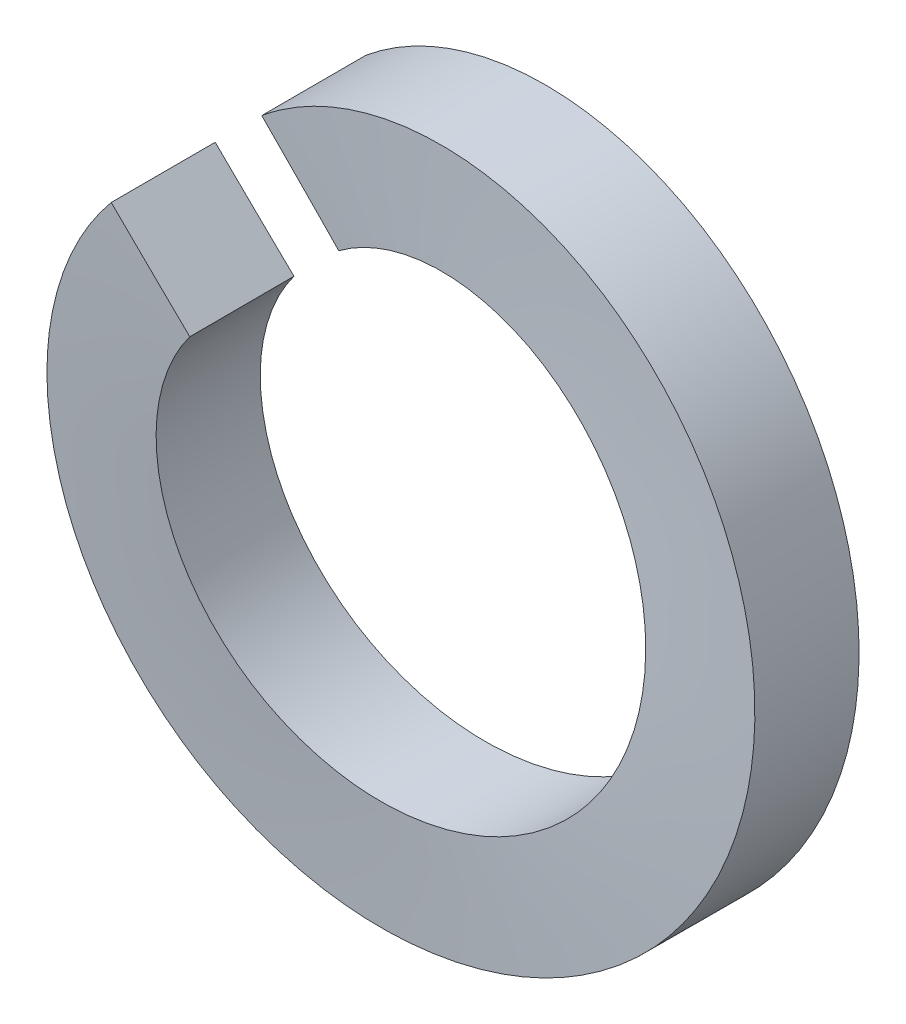
ISO-10303-21;
HEADER;
FILE_DESCRIPTION(('STEP AP214'),'2;1');
FILE_NAME('part.step','',(''),(''),'','','');
FILE_SCHEMA(('AUTOMOTIVE_DESIGN { 1 0 10303 214 1 1 1 1 }'));
ENDSEC;
DATA;
#1=APPLICATION_CONTEXT('core data for automotive mechanical design processes');
#2=APPLICATION_PROTOCOL_DEFINITION('international standard','automotive_design',2000,#1);
#3=PRODUCT_CONTEXT('',#1,'mechanical');
#4=PRODUCT('Part','Part','',(#3));
#5=PRODUCT_RELATED_PRODUCT_CATEGORY('part','',(#4));
#6=PRODUCT_DEFINITION_FORMATION('','',#4);
#7=PRODUCT_DEFINITION_CONTEXT('part definition',#1,'design');
#8=PRODUCT_DEFINITION('design','',#6,#7);
#9=PRODUCT_DEFINITION_SHAPE('','',#8);
#10=(LENGTH_UNIT() NAMED_UNIT(*) SI_UNIT(.MILLI.,.METRE.));
#11=(NAMED_UNIT(*) PLANE_ANGLE_UNIT() SI_UNIT($,.RADIAN.));
#12=(NAMED_UNIT(*) SI_UNIT($,.STERADIAN.) SOLID_ANGLE_UNIT());
#13=UNCERTAINTY_MEASURE_WITH_UNIT(LENGTH_MEASURE(1.E-05),#10,'distance_accuracy_value','');
#14=(GEOMETRIC_REPRESENTATION_CONTEXT(3) GLOBAL_UNCERTAINTY_ASSIGNED_CONTEXT((#13)) GLOBAL_UNIT_ASSIGNED_CONTEXT((#10,
#11,#12)) REPRESENTATION_CONTEXT('',''));
#15=CARTESIAN_POINT('',(0.,0.,0.));
#16=DIRECTION('',(0.,0.,1.));
#17=DIRECTION('',(1.,0.,0.));
#18=AXIS2_PLACEMENT_3D('',#15,#16,#17);
#19=CARTESIAN_POINT('',(-0.79717352333944,-0.298841987499716,-2.94193677893216));
#20=DIRECTION('',(-0.707106781186547,-0.707106781186548,0.));
#21=DIRECTION('',(-0.707106781186548,0.707106781186547,0.));
#22=AXIS2_PLACEMENT_3D('',#19,#20,#21);
#23=PLANE('',#22);
#24=CARTESIAN_POINT('',(-4.83003302335356,3.73401751251441,0.233956789733909));
#25=CARTESIAN_POINT('',(-4.82942869376248,3.73341318292332,0.480258416201876));
#26=CARTESIAN_POINT('',(-4.82889978139412,3.73288427055496,0.72656043590296));
#27=CARTESIAN_POINT('',(-4.82844636876401,3.73243085792486,0.972862710482893));
#28=CARTESIAN_POINT('',(-4.82776624871645,3.7317507378773,1.34231672119706));
#29=CARTESIAN_POINT('',(-4.82725600894082,3.73124049810167,1.71177143564769));
#30=CARTESIAN_POINT('',(-4.82691582892287,3.73090031808371,2.08122638515365));
#31=CARTESIAN_POINT('',(-4.8265756483286,3.73056013748944,2.45068196055829));
#32=CARTESIAN_POINT('',(-4.82640552795078,3.73039001711163,2.82013792746677));
#33=CARTESIAN_POINT('',(-4.82640552795078,3.73039001711163,3.18959381609657));
#34=(BOUNDED_CURVE() B_SPLINE_CURVE(3,(#24,#25,#26,#27,#28,#29,#30,#31,#32,#33),.UNSPECIFIED.,
.F.,.F.) B_SPLINE_CURVE_WITH_KNOTS((4,3,3,4),(0.,0.000738909327768621,0.00184727524639722,
0.0029556430429443),
.UNSPECIFIED.) CURVE() GEOMETRIC_REPRESENTATION_ITEM() RATIONAL_B_SPLINE_CURVE((1.,1.,1.,1.,1.,
1.,1.,1.,1.,1.)) REPRESENTATION_ITEM(''));
#35=CARTESIAN_POINT('',(-4.83003302335356,3.73401751251441,0.233956789733909));
#36=VERTEX_POINT('',#35);
#37=CARTESIAN_POINT('',(-4.82640552795078,3.73039001711163,3.18959381609657));
#38=VERTEX_POINT('',#37);
#39=EDGE_CURVE('E90',#36,#38,#34,.T.);
#40=ORIENTED_EDGE('',*,*,#39,.F.);
#41=CARTESIAN_POINT('',(-7.03266197867871,5.93664646783831,0.263458357318975));
#42=CARTESIAN_POINT('',(-6.93459888887038,5.83858145641255,0.262589733309795));
#43=CARTESIAN_POINT('',(-6.8365383405626,5.74051423528715,0.261682285772375));
#44=CARTESIAN_POINT('',(-6.64460715068996,5.54857100489026,0.259817397518075));
#45=CARTESIAN_POINT('',(-6.55073651244149,5.45469495535241,0.258863749689647));
#46=CARTESIAN_POINT('',(-6.36718086196401,5.27113870108968,0.256906559268797));
#47=CARTESIAN_POINT('',(-6.27749605053265,5.18145825180581,0.255907143965681));
#48=CARTESIAN_POINT('',(-6.10231425396689,5.00629057531517,0.253857861133127));
#49=CARTESIAN_POINT('',(-6.01681737315664,4.92080319082117,0.252812532189602));
#50=CARTESIAN_POINT('',(-5.83187683803377,4.73585978614604,0.250437601692356));
#51=CARTESIAN_POINT('',(-5.73243521311544,4.63640197273893,0.24908945246533));
#52=CARTESIAN_POINT('',(-5.53866662832727,4.44260513698395,0.246300117609943));
#53=CARTESIAN_POINT('',(-5.44433969326801,4.34826597004379,0.244867284773658));
#54=CARTESIAN_POINT('',(-5.26079041912217,4.16471749134578,0.241908164560969));
#55=CARTESIAN_POINT('',(-5.1715686728636,4.07550743853658,0.240391159500856));
#56=CARTESIAN_POINT('',(-4.99824081618342,3.90220506264143,0.237260448250175));
#57=CARTESIAN_POINT('',(-4.91413468957235,3.81811256487991,0.235657272741076));
#58=CARTESIAN_POINT('',(-4.83003302335348,3.73401751251451,0.233956789733921));
#59=B_SPLINE_CURVE_WITH_KNOTS('',3,(#41,#42,#43,#44,#45,#46,#47,#48,#49,#50,#51,#52,#53,#54,#55,
#56,#57,#58),.UNSPECIFIED.,.F.,.F.,(4,2,2,2,2,2,2,2,4),(0.,0.416058698813507,0.814339815610209,
1.19484277004973,1.55756869060549,1.97951741246603,2.37976164285733,2.75829987487904,
3.11513536136346),.UNSPECIFIED.);
#60=CARTESIAN_POINT('',(-7.03266197867871,5.93664646783831,0.263458357318974));
#61=VERTEX_POINT('',#60);
#62=EDGE_CURVE('E76',#61,#36,#59,.T.);
#63=ORIENTED_EDGE('',*,*,#62,.F.);
#64=CARTESIAN_POINT('',(-7.03026719947147,5.93425168863231,3.21187950314586));
#65=CARTESIAN_POINT('',(-7.03026719947147,5.93425168863231,2.96617773085928));
#66=CARTESIAN_POINT('',(-7.03031710092935,5.93430159009019,2.72047594843941));
#67=CARTESIAN_POINT('',(-7.03041689996159,5.93440138912244,2.47477421668915));
#68=CARTESIAN_POINT('',(-7.03056659861644,5.93455108777728,2.10622135690906));
#69=CARTESIAN_POINT('',(-7.03082856860665,5.93481305776749,1.7376685541582));
#70=CARTESIAN_POINT('',(-7.03120276791604,5.93518725707688,1.36911601350597));
#71=CARTESIAN_POINT('',(-7.03157696750304,5.93556145666388,1.00056319943737));
#72=CARTESIAN_POINT('',(-7.03206339663907,5.93604788579991,0.632010579137902));
#73=CARTESIAN_POINT('',(-7.03266197867871,5.93664646783831,0.263458357318974));
#74=(BOUNDED_CURVE() B_SPLINE_CURVE(3,(#64,#65,#66,#67,#68,#69,#70,#71,#72,#73),.UNSPECIFIED.,
.F.,.F.) B_SPLINE_CURVE_WITH_KNOTS((4,3,3,4),(0.,0.000737105316859754,0.0018427641355887,
0.00294842377449577),
.UNSPECIFIED.) CURVE() GEOMETRIC_REPRESENTATION_ITEM() RATIONAL_B_SPLINE_CURVE((1.,1.,1.,1.,1.,
1.,1.,1.,1.,1.)) REPRESENTATION_ITEM(''));
#75=CARTESIAN_POINT('',(-7.03026719947147,5.93425168863231,3.21187950314586));
#76=VERTEX_POINT('',#75);
#77=EDGE_CURVE('E31',#76,#61,#74,.T.);
#78=ORIENTED_EDGE('',*,*,#77,.F.);
#79=CARTESIAN_POINT('',(-4.82640552795078,3.73039001711163,3.18959381609657));
#80=CARTESIAN_POINT('',(-5.01550774301604,3.91949223217689,3.19248624401942));
#81=CARTESIAN_POINT('',(-5.20461291247181,4.10859740163265,3.19500315576721));
#82=CARTESIAN_POINT('',(-5.39371944648951,4.29770393565035,3.19726129838612));
#83=CARTESIAN_POINT('',(-5.58282590428486,4.4868103934457,3.19951944009485));
#84=CARTESIAN_POINT('',(-5.77193396066378,4.67591844982462,3.20151717024981));
#85=CARTESIAN_POINT('',(-5.96104282447109,4.86502731363194,3.20332803269508));
#86=CARTESIAN_POINT('',(-6.317448478768,5.22143296792885,3.20674089025053));
#87=CARTESIAN_POINT('',(-6.67385734981149,5.57784183897233,3.20949905003783));
#88=CARTESIAN_POINT('',(-7.03026719947147,5.93425168863231,3.21187950314586));
#89=(BOUNDED_CURVE() B_SPLINE_CURVE(3,(#79,#80,#81,#82,#83,#84,#85,#86,#87,#88),.UNSPECIFIED.,
.F.,.F.) B_SPLINE_CURVE_WITH_KNOTS((4,3,3,4),(0.,0.000802339675337197,0.00160467884234959,
0.00311681475547326),
.UNSPECIFIED.) CURVE() GEOMETRIC_REPRESENTATION_ITEM() RATIONAL_B_SPLINE_CURVE((1.,1.,1.,1.,1.,
1.,1.,1.,1.,1.)) REPRESENTATION_ITEM(''));
#90=EDGE_CURVE('E92',#38,#76,#89,.T.);
#91=ORIENTED_EDGE('',*,*,#90,.F.);
#92=EDGE_LOOP('',(#40,#63,#78,#91));
#93=FACE_BOUND('',#92,.T.);
#94=ADVANCED_FACE('F16',(#93),#23,.F.);
#95=CARTESIAN_POINT('',(-34.7029436812344,35.7989591920735,-2.94193677893216));
#96=DIRECTION('',(0.707106781186547,0.707106781186548,0.));
#97=DIRECTION('',(0.,0.,-1.));
#98=AXIS2_PLACEMENT_3D('',#95,#96,#97);
#99=PLANE('',#98);
#100=CARTESIAN_POINT('',(-5.93664646783898,7.03266197867814,-2.90526477562874));
#101=CARTESIAN_POINT('',(-5.93624740887282,7.03226291971198,-2.65956664083558));
#102=CARTESIAN_POINT('',(-5.9358981972157,7.03191370805485,-2.41386833399742));
#103=CARTESIAN_POINT('',(-5.93559885637714,7.03161436721629,-2.16816991575449));
#104=CARTESIAN_POINT('',(-5.93514984480018,7.03116535563934,-1.79962202646663));
#105=CARTESIAN_POINT('',(-5.93481304426725,7.0308285551064,-1.43107382956403));
#106=CARTESIAN_POINT('',(-5.93458850527651,7.03060401611566,-1.06252553003491));
#107=CARTESIAN_POINT('',(-5.93436396611914,7.0303794769583,-0.693976957004398));
#108=CARTESIAN_POINT('',(-5.93425168863232,7.03026719947147,-0.325428212977408));
#109=CARTESIAN_POINT('',(-5.93425168863221,7.03026719947156,0.0431204968541365));
#110=(BOUNDED_CURVE() B_SPLINE_CURVE(3,(#100,#101,#102,#103,#104,#105,#106,#107,#108,#109),
.UNSPECIFIED.,.F.,.F.) B_SPLINE_CURVE_WITH_KNOTS((4,3,3,4),(0.,0.000737096348812416,
0.00184274171479007,0.00294838790131264),
.UNSPECIFIED.) CURVE() GEOMETRIC_REPRESENTATION_ITEM() RATIONAL_B_SPLINE_CURVE((1.,1.,1.,1.,1.,
1.,1.,1.,1.,1.)) REPRESENTATION_ITEM(''));
#111=CARTESIAN_POINT('',(-5.93664646783898,7.03266197867814,-2.90526477562874));
#112=VERTEX_POINT('',#111);
#113=CARTESIAN_POINT('',(-5.93425168863221,7.03026719947156,0.0431204968541365));
#114=VERTEX_POINT('',#113);
#115=EDGE_CURVE('E10',#112,#114,#110,.T.);
#116=ORIENTED_EDGE('',*,*,#115,.F.);
#117=CARTESIAN_POINT('',(-3.73401751251441,4.83003302335356,-2.89022457300165));
#118=CARTESIAN_POINT('',(-3.92312566222214,5.01914117306129,-2.89217791580275));
#119=CARTESIAN_POINT('',(-4.11223516142621,5.20825067226537,-2.8938772478152));
#120=CARTESIAN_POINT('',(-4.30134528266825,5.39736079350741,-2.8954017829888));
#121=CARTESIAN_POINT('',(-4.4904553689851,5.58647087982426,-2.89692631788084));
#122=CARTESIAN_POINT('',(-4.67956618436761,5.77558169520676,-2.89827492761064));
#123=CARTESIAN_POINT('',(-4.8686773676421,5.96469287848125,-2.89949739282771));
#124=CARTESIAN_POINT('',(-5.22466594429587,6.32068145513502,-2.90179859810332));
#125=CARTESIAN_POINT('',(-5.58065598338201,6.67667149422116,-2.90365887592926));
#126=CARTESIAN_POINT('',(-5.93664646783898,7.03266197867814,-2.90526477562874));
#127=(BOUNDED_CURVE() B_SPLINE_CURVE(3,(#117,#118,#119,#120,#121,#122,#123,#124,#125,#126),
.UNSPECIFIED.,.F.,.F.) B_SPLINE_CURVE_WITH_KNOTS((4,3,3,4),(0.,0.00080233933038256,
0.00160467842791897,0.00311502587816711),
.UNSPECIFIED.) CURVE() GEOMETRIC_REPRESENTATION_ITEM() RATIONAL_B_SPLINE_CURVE((1.,1.,1.,1.,1.,
1.,1.,1.,1.,1.)) REPRESENTATION_ITEM(''));
#128=CARTESIAN_POINT('',(-3.73401751251441,4.83003302335356,-2.89022457300165));
#129=VERTEX_POINT('',#128);
#130=EDGE_CURVE('E86',#129,#112,#127,.T.);
#131=ORIENTED_EDGE('',*,*,#130,.F.);
#132=CARTESIAN_POINT('',(-3.73039001711163,4.82640552795078,0.0654061839034188));
#133=CARTESIAN_POINT('',(-3.73039001711163,4.82640552795078,-0.427199127865151));
#134=CARTESIAN_POINT('',(-3.73069246402826,4.82670797486741,-0.91980462509811));
#135=CARTESIAN_POINT('',(-3.73129716999029,4.82731268082945,-1.41240919454911));
#136=CARTESIAN_POINT('',(-3.73159952379665,4.8276150346358,-1.65871215160789));
#137=CARTESIAN_POINT('',(-3.73197743693886,4.82799294777801,-1.90501494630183));
#138=CARTESIAN_POINT('',(-3.73243085060459,4.82844636144374,-2.15131743984105));
#139=CARTESIAN_POINT('',(-3.73288426461122,4.82889977545037,-2.3976201185631));
#140=CARTESIAN_POINT('',(-3.73341317933273,4.82942869017189,-2.64392254240305));
#141=CARTESIAN_POINT('',(-3.73401751251441,4.83003302335356,-2.89022457300165));
#142=(BOUNDED_CURVE() B_SPLINE_CURVE(3,(#132,#133,#134,#135,#136,#137,#138,#139,#140,#141),
.UNSPECIFIED.,.F.,.F.) B_SPLINE_CURVE_WITH_KNOTS((4,3,3,4),(0.,0.00147781593530571,
0.00221672571115192,0.00295563604246229),
.UNSPECIFIED.) CURVE() GEOMETRIC_REPRESENTATION_ITEM() RATIONAL_B_SPLINE_CURVE((1.,1.,1.,1.,1.,
1.,1.,1.,1.,1.)) REPRESENTATION_ITEM(''));
#143=CARTESIAN_POINT('',(-3.73039001711163,4.82640552795078,0.0654061839034188));
#144=VERTEX_POINT('',#143);
#145=EDGE_CURVE('E97',#144,#129,#142,.T.);
#146=ORIENTED_EDGE('',*,*,#145,.F.);
#147=CARTESIAN_POINT('',(-5.93425168863221,7.03026719947156,0.0431204968541365));
#148=CARTESIAN_POINT('',(-5.74514065292749,6.84115616376664,0.0443835650693762));
#149=CARTESIAN_POINT('',(-5.55602995618481,6.65204546702397,0.0457562183701629));
#150=CARTESIAN_POINT('',(-5.36691985353237,6.46293536437153,0.0472731697832934));
#151=CARTESIAN_POINT('',(-5.17780973613226,6.27382524697141,0.0487901213147227));
#152=CARTESIAN_POINT('',(-4.98870014651119,6.08471565735034,0.0504508636932461));
#153=CARTESIAN_POINT('',(-4.79959153775048,5.89560704858964,0.0523062163031964));
#154=CARTESIAN_POINT('',(-4.44318623242566,5.53920174326481,0.0558029239241135));
#155=CARTESIAN_POINT('',(-4.08678305456905,5.18279856540821,0.0599549459436002));
#156=CARTESIAN_POINT('',(-3.73039001711163,4.82640552795078,0.0654061839034188));
#157=(BOUNDED_CURVE() B_SPLINE_CURVE(3,(#147,#148,#149,#150,#151,#152,#153,#154,#155,#156),
.UNSPECIFIED.,.F.,.F.) B_SPLINE_CURVE_WITH_KNOTS((4,3,3,4),(0.,0.000802339122147359,
0.00160467835295775,0.00311681639490489),
.UNSPECIFIED.) CURVE() GEOMETRIC_REPRESENTATION_ITEM() RATIONAL_B_SPLINE_CURVE((1.,1.,1.,1.,1.,
1.,1.,1.,1.,1.)) REPRESENTATION_ITEM(''));
#158=EDGE_CURVE('E102',#114,#144,#157,.T.);
#159=ORIENTED_EDGE('',*,*,#158,.F.);
#160=EDGE_LOOP('',(#116,#131,#146,#159));
#161=FACE_BOUND('',#160,.T.);
#162=ADVANCED_FACE('F146',(#161),#99,.F.);
#163=CARTESIAN_POINT('',(-6.32916406997627,6.6816007038562,0.320563221067842));
#164=CARTESIAN_POINT('',(-8.11949358272176,4.98570630254198,0.184938221067843));
#165=CARTESIAN_POINT('',(-8.82201722124726,2.62185391249532,0.0493132210678426));
#166=CARTESIAN_POINT('',(-9.52454085977277,0.258001522448659,-0.0863117789321575));
#167=CARTESIAN_POINT('',(-8.95101798247159,-2.14041651739106,-0.221936778932158));
#168=CARTESIAN_POINT('',(-8.37749510517042,-4.53883455723078,-0.357561778932157));
#169=CARTESIAN_POINT('',(-6.6816007038562,-6.32916406997627,-0.493186778932158));
#170=CARTESIAN_POINT('',(-4.98570630254198,-8.11949358272176,-0.628811778932158));
#171=CARTESIAN_POINT('',(-2.62185391249532,-8.82201722124726,-0.764436778932157));
#172=CARTESIAN_POINT('',(-0.25800152244866,-9.52454085977277,-0.900061778932158));
#173=CARTESIAN_POINT('',(2.14041651739105,-8.95101798247159,-1.03568677893216));
#174=CARTESIAN_POINT('',(4.53883455723078,-8.37749510517042,-1.17131177893216));
#175=CARTESIAN_POINT('',(6.32916406997627,-6.6816007038562,-1.30693677893216));
#176=CARTESIAN_POINT('',(8.11949358272176,-4.98570630254198,-1.44256177893216));
#177=CARTESIAN_POINT('',(8.82201722124726,-2.62185391249532,-1.57818677893216));
#178=CARTESIAN_POINT('',(9.52454085977277,-0.258001522448663,-1.71381177893216));
#179=CARTESIAN_POINT('',(8.95101798247159,2.14041651739105,-1.84943677893216));
#180=CARTESIAN_POINT('',(8.37749510517042,4.53883455723077,-1.98506177893216));
#181=CARTESIAN_POINT('',(6.6816007038562,6.32916406997627,-2.12068677893216));
#182=CARTESIAN_POINT('',(4.98570630254198,8.11949358272176,-2.25631177893216));
#183=CARTESIAN_POINT('',(2.62185391249533,8.82201722124726,-2.39193677893216));
#184=CARTESIAN_POINT('',(0.258001522448662,9.52454085977277,-2.52756177893216));
#185=CARTESIAN_POINT('',(-2.14041651739105,8.95101798247159,-2.66318677893216));
#186=CARTESIAN_POINT('',(-4.53883455723077,8.37749510517042,-2.79881177893216));
#187=CARTESIAN_POINT('',(-6.32916406997627,6.6816007038562,-2.93443677893216));
#188=CARTESIAN_POINT('',(-6.50538238691618,6.50538238691629,3.255));
#189=CARTESIAN_POINT('',(-8.24849434394605,4.76227042988646,3.119375));
#190=CARTESIAN_POINT('',(-8.8865176018594,2.38113521494327,2.98375));
#191=CARTESIAN_POINT('',(-9.52454085977277,0.,2.848125));
#192=CARTESIAN_POINT('',(-8.88651760185945,-2.38113521494311,2.7125));
#193=CARTESIAN_POINT('',(-8.24849434394613,-4.7622704298863,2.576875));
#194=CARTESIAN_POINT('',(-6.50538238691629,-6.50538238691618,2.44125));
#195=CARTESIAN_POINT('',(-4.76227042988646,-8.24849434394605,2.305625));
#196=CARTESIAN_POINT('',(-2.38113521494327,-8.8865176018594,2.17));
#197=CARTESIAN_POINT('',(0.,-9.52454085977277,2.034375));
#198=CARTESIAN_POINT('',(2.38113521494311,-8.88651760185945,1.89875));
#199=CARTESIAN_POINT('',(4.7622704298863,-8.24849434394613,1.763125));
#200=CARTESIAN_POINT('',(6.50538238691617,-6.50538238691629,1.6275));
#201=CARTESIAN_POINT('',(8.24849434394605,-4.76227042988646,1.491875));
#202=CARTESIAN_POINT('',(8.8865176018594,-2.38113521494327,1.35625));
#203=CARTESIAN_POINT('',(9.52454085977277,0.,1.220625));
#204=CARTESIAN_POINT('',(8.88651760185945,2.38113521494311,1.085));
#205=CARTESIAN_POINT('',(8.24849434394613,4.7622704298863,0.949375));
#206=CARTESIAN_POINT('',(6.50538238691629,6.50538238691617,0.81375));
#207=CARTESIAN_POINT('',(4.76227042988647,8.24849434394605,0.678125));
#208=CARTESIAN_POINT('',(2.38113521494327,8.8865176018594,0.5425));
#209=CARTESIAN_POINT('',(0.,9.52454085977277,0.406874999999999));
#210=CARTESIAN_POINT('',(-2.38113521494311,8.88651760185945,0.27125));
#211=CARTESIAN_POINT('',(-4.7622704298863,8.24849434394614,0.135625));
#212=CARTESIAN_POINT('',(-6.50538238691618,6.50538238691629,0.));
#213=(BOUNDED_SURFACE() B_SPLINE_SURFACE(1,2,((#163,#164,#165,#166,#167,#168,#169,#170,#171,
#172,#173,#174,#175,#176,#177,#178,#179,#180,#181,#182,#183,#184,#185,#186,#187),(#188,#189,
#190,#191,#192,#193,#194,#195,#196,#197,#198,#199,#200,#201,#202,#203,#204,#205,#206,#207,#208,
#209,#210,#211,#212)),.UNSPECIFIED.,.F.,.F.,.F.) B_SPLINE_SURFACE_WITH_KNOTS((2,2),(3,2,2,2,2,2,
2,2,2,2,2,2,3),(0.756410256410257,1.),(0.,0.0833333333333333,0.166666666666667,0.25,
0.333333333333334,0.416666666666667,0.5,0.583333333333333,0.666666666666667,0.75,
0.833333333333333,0.916666666666667,1.),
.UNSPECIFIED.) GEOMETRIC_REPRESENTATION_ITEM() RATIONAL_B_SPLINE_SURFACE(((1.,0.965925826289068,
1.,0.965925826289068,1.,0.965925826289068,1.,0.965925826289068,1.,0.965925826289068,1.,
0.965925826289068,1.,0.965925826289068,1.,0.965925826289068,1.,0.965925826289068,1.,
0.965925826289068,1.,0.965925826289068,1.,0.965925826289068,1.),(1.,0.965925826289068,1.,
0.965925826289068,1.,0.965925826289068,1.,0.965925826289068,1.,0.965925826289068,1.,
0.965925826289068,1.,0.965925826289068,1.,0.965925826289068,1.,0.965925826289068,1.,
0.965925826289068,1.,0.965925826289068,1.,0.965925826289068,1.))) REPRESENTATION_ITEM('') SURFACE());
#214=CARTESIAN_POINT('',(-7.03026719947148,5.93425168863231,3.21187950314586));
#215=CARTESIAN_POINT('',(-8.35497490250793,4.36487957531516,3.09674036156662));
#216=CARTESIAN_POINT('',(-8.8865176018594,2.38113521494327,2.98375));
#217=CARTESIAN_POINT('',(-9.52454085977277,0.,2.848125));
#218=CARTESIAN_POINT('',(-8.88651760185945,-2.38113521494311,2.7125));
#219=CARTESIAN_POINT('',(-8.24849434394613,-4.7622704298863,2.576875));
#220=CARTESIAN_POINT('',(-6.50538238691629,-6.50538238691618,2.44125));
#221=CARTESIAN_POINT('',(-4.76227042988646,-8.24849434394605,2.305625));
#222=CARTESIAN_POINT('',(-2.38113521494327,-8.8865176018594,2.17));
#223=CARTESIAN_POINT('',(0.,-9.52454085977277,2.034375));
#224=CARTESIAN_POINT('',(2.38113521494311,-8.88651760185945,1.89875));
#225=CARTESIAN_POINT('',(4.7622704298863,-8.24849434394613,1.763125));
#226=CARTESIAN_POINT('',(6.50538238691617,-6.50538238691629,1.6275));
#227=CARTESIAN_POINT('',(8.24849434394605,-4.76227042988646,1.491875));
#228=CARTESIAN_POINT('',(8.8865176018594,-2.38113521494327,1.35625));
#229=CARTESIAN_POINT('',(9.52454085977277,0.,1.220625));
#230=CARTESIAN_POINT('',(8.88651760185945,2.38113521494311,1.085));
#231=CARTESIAN_POINT('',(8.24849434394614,4.7622704298863,0.949375));
#232=CARTESIAN_POINT('',(6.50538238691629,6.50538238691617,0.81375));
#233=CARTESIAN_POINT('',(4.76227042988647,8.24849434394605,0.678125));
#234=CARTESIAN_POINT('',(2.38113521494327,8.8865176018594,0.5425));
#235=CARTESIAN_POINT('',(0.,9.52454085977277,0.406874999999999));
#236=CARTESIAN_POINT('',(-2.38113521494311,8.88651760185945,0.27125));
#237=CARTESIAN_POINT('',(-4.36487957531502,8.35497490250802,0.15825963843338));
#238=CARTESIAN_POINT('',(-5.93425168863221,7.03026719947156,0.0431204968541365));
#239=(BOUNDED_CURVE() B_SPLINE_CURVE(2,(#214,#215,#216,#217,#218,#219,#220,#221,#222,#223,#224,
#225,#226,#227,#228,#229,#230,#231,#232,#233,#234,#235,#236,#237,#238),.UNSPECIFIED.,.F.,
.F.) B_SPLINE_CURVE_WITH_KNOTS((3,2,2,2,2,2,2,2,2,2,2,2,3),(0.0135105518026357,
0.0833333333333333,0.166666666666667,0.25,0.333333333333334,0.416666666666667,0.5,
0.583333333333333,0.666666666666667,0.75,0.833333333333333,0.916666666666667,0.986489448197365),
.UNSPECIFIED.) CURVE() GEOMETRIC_REPRESENTATION_ITEM() RATIONAL_B_SPLINE_CURVE((0.990742620798881,
0.971450156957711,1.,0.965925826289068,1.,0.965925826289068,1.,0.965925826289068,1.,
0.965925826289068,1.,0.965925826289068,1.,0.965925826289068,1.,0.965925826289068,1.,
0.965925826289068,1.,0.965925826289068,1.,0.965925826289068,1.,0.971450156957711,0.990742620798881)) REPRESENTATION_ITEM(''));
#240=EDGE_CURVE('E107',#76,#114,#239,.T.);
#241=CARTESIAN_POINT('',(-7.03266197867871,5.93664646783831,0.263458357318975));
#242=CARTESIAN_POINT('',(-8.27385716573652,4.46630353139613,0.155137713585535));
#243=CARTESIAN_POINT('',(-8.82201722124726,2.62185391249532,0.0493132210678426));
#244=CARTESIAN_POINT('',(-9.52454085977277,0.258001522448659,-0.0863117789321575));
#245=CARTESIAN_POINT('',(-8.95101798247159,-2.14041651739106,-0.221936778932158));
#246=CARTESIAN_POINT('',(-8.37749510517042,-4.53883455723078,-0.357561778932158));
#247=CARTESIAN_POINT('',(-6.6816007038562,-6.32916406997627,-0.493186778932158));
#248=CARTESIAN_POINT('',(-4.98570630254198,-8.11949358272176,-0.628811778932158));
#249=CARTESIAN_POINT('',(-2.62185391249532,-8.82201722124726,-0.764436778932157));
#250=CARTESIAN_POINT('',(-0.25800152244866,-9.52454085977277,-0.900061778932158));
#251=CARTESIAN_POINT('',(2.14041651739105,-8.95101798247159,-1.03568677893216));
#252=CARTESIAN_POINT('',(4.53883455723078,-8.37749510517042,-1.17131177893216));
#253=CARTESIAN_POINT('',(6.32916406997627,-6.6816007038562,-1.30693677893216));
#254=CARTESIAN_POINT('',(8.11949358272176,-4.98570630254198,-1.44256177893216));
#255=CARTESIAN_POINT('',(8.82201722124726,-2.62185391249532,-1.57818677893216));
#256=CARTESIAN_POINT('',(9.52454085977277,-0.258001522448663,-1.71381177893216));
#257=CARTESIAN_POINT('',(8.95101798247159,2.14041651739105,-1.84943677893216));
#258=CARTESIAN_POINT('',(8.37749510517042,4.53883455723077,-1.98506177893216));
#259=CARTESIAN_POINT('',(6.6816007038562,6.32916406997627,-2.12068677893216));
#260=CARTESIAN_POINT('',(4.98570630254198,8.11949358272176,-2.25631177893216));
#261=CARTESIAN_POINT('',(2.62185391249533,8.82201722124726,-2.39193677893216));
#262=CARTESIAN_POINT('',(0.258001522448662,9.52454085977277,-2.52756177893216));
#263=CARTESIAN_POINT('',(-2.14041651739105,8.95101798247159,-2.66318677893216));
#264=CARTESIAN_POINT('',(-4.26634262668811,8.44265487025316,-2.78340298969443));
#265=CARTESIAN_POINT('',(-5.93664646783898,7.03266197867815,-2.90526477562874));
#266=(BOUNDED_CURVE() B_SPLINE_CURVE(2,(#241,#242,#243,#244,#245,#246,#247,#248,#249,#250,#251,
#252,#253,#254,#255,#256,#257,#258,#259,#260,#261,#262,#263,#264,#265),.UNSPECIFIED.,.F.,
.F.) B_SPLINE_CURVE_WITH_KNOTS((3,2,2,2,2,2,2,2,2,2,2,2,3),(0.0178201045408197,
0.0833333333333333,0.166666666666667,0.25,0.333333333333334,0.416666666666667,0.5,
0.583333333333333,0.666666666666667,0.75,0.833333333333333,0.916666666666667,0.990819299236785),
.UNSPECIFIED.) CURVE() GEOMETRIC_REPRESENTATION_ITEM() RATIONAL_B_SPLINE_CURVE((0.98854336512327,
0.973212290341118,1.,0.965925826289068,1.,0.965925826289068,1.,0.965925826289068,1.,
0.965925826289068,1.,0.965925826289068,1.,0.965925826289068,1.,0.965925826289068,1.,
0.965925826289068,1.,0.965925826289068,1.,0.965925826289068,1.,0.969679723800195,0.993319326811637)) REPRESENTATION_ITEM(''));
#267=EDGE_CURVE('E82',#61,#112,#266,.T.);
#268=ORIENTED_EDGE('',*,*,#240,.F.);
#269=ORIENTED_EDGE('',*,*,#77,.T.);
#270=ORIENTED_EDGE('',*,*,#267,.T.);
#271=ORIENTED_EDGE('',*,*,#115,.T.);
#272=EDGE_LOOP('',(#268,#269,#270,#271));
#273=FACE_BOUND('',#272,.T.);
#274=ADVANCED_FACE('F149',(#273),#213,.F.);
#275=CARTESIAN_POINT('',(-4.13713304829799,4.48956968217788,0.320563221067843));
#276=CARTESIAN_POINT('',(-5.3401096190008,3.38102822290632,0.184938221067843));
#277=CARTESIAN_POINT('',(-5.82764715975115,1.81951487267748,0.0493132210678431));
#278=CARTESIAN_POINT('',(-6.31518470050151,0.25800152244863,-0.086311778932157));
#279=CARTESIAN_POINT('',(-5.95664792097547,-1.33807747757327,-0.221936778932157));
#280=CARTESIAN_POINT('',(-5.59811114144944,-2.93415647759517,-0.357561778932157));
#281=CARTESIAN_POINT('',(-4.48956968217788,-4.13713304829799,-0.493186778932157));
#282=CARTESIAN_POINT('',(-3.38102822290632,-5.3401096190008,-0.628811778932158));
#283=CARTESIAN_POINT('',(-1.81951487267748,-5.82764715975115,-0.764436778932157));
#284=CARTESIAN_POINT('',(-0.25800152244863,-6.31518470050151,-0.900061778932158));
#285=CARTESIAN_POINT('',(1.33807747757327,-5.95664792097547,-1.03568677893216));
#286=CARTESIAN_POINT('',(2.93415647759517,-5.59811114144944,-1.17131177893216));
#287=CARTESIAN_POINT('',(4.13713304829799,-4.48956968217788,-1.30693677893216));
#288=CARTESIAN_POINT('',(5.3401096190008,-3.38102822290633,-1.44256177893216));
#289=CARTESIAN_POINT('',(5.82764715975115,-1.81951487267748,-1.57818677893215));
#290=CARTESIAN_POINT('',(6.31518470050151,-0.258001522448633,-1.71381177893216));
#291=CARTESIAN_POINT('',(5.95664792097547,1.33807747757327,-1.84943677893216));
#292=CARTESIAN_POINT('',(5.59811114144944,2.93415647759517,-1.98506177893216));
#293=CARTESIAN_POINT('',(4.48956968217788,4.13713304829799,-2.12068677893215));
#294=CARTESIAN_POINT('',(3.38102822290633,5.3401096190008,-2.25631177893216));
#295=CARTESIAN_POINT('',(1.81951487267748,5.82764715975115,-2.39193677893215));
#296=CARTESIAN_POINT('',(0.258001522448631,6.31518470050151,-2.52756177893216));
#297=CARTESIAN_POINT('',(-1.33807747757327,5.95664792097547,-2.66318677893215));
#298=CARTESIAN_POINT('',(-2.93415647759517,5.59811114144944,-2.79881177893216));
#299=CARTESIAN_POINT('',(-4.13713304829799,4.48956968217788,-2.93443677893216));
#300=CARTESIAN_POINT('',(-6.32916406997627,6.6816007038562,0.320563221067842));
#301=CARTESIAN_POINT('',(-8.11949358272176,4.98570630254198,0.184938221067843));
#302=CARTESIAN_POINT('',(-8.82201722124726,2.62185391249532,0.0493132210678426));
#303=CARTESIAN_POINT('',(-9.52454085977277,0.258001522448659,-0.0863117789321575));
#304=CARTESIAN_POINT('',(-8.95101798247159,-2.14041651739106,-0.221936778932158));
#305=CARTESIAN_POINT('',(-8.37749510517042,-4.53883455723078,-0.357561778932157));
#306=CARTESIAN_POINT('',(-6.6816007038562,-6.32916406997627,-0.493186778932158));
#307=CARTESIAN_POINT('',(-4.98570630254198,-8.11949358272176,-0.628811778932158));
#308=CARTESIAN_POINT('',(-2.62185391249532,-8.82201722124726,-0.764436778932157));
#309=CARTESIAN_POINT('',(-0.25800152244866,-9.52454085977277,-0.900061778932158));
#310=CARTESIAN_POINT('',(2.14041651739105,-8.95101798247159,-1.03568677893216));
#311=CARTESIAN_POINT('',(4.53883455723078,-8.37749510517042,-1.17131177893216));
#312=CARTESIAN_POINT('',(6.32916406997627,-6.6816007038562,-1.30693677893216));
#313=CARTESIAN_POINT('',(8.11949358272176,-4.98570630254198,-1.44256177893216));
#314=CARTESIAN_POINT('',(8.82201722124726,-2.62185391249532,-1.57818677893216));
#315=CARTESIAN_POINT('',(9.52454085977277,-0.258001522448663,-1.71381177893216));
#316=CARTESIAN_POINT('',(8.95101798247159,2.14041651739105,-1.84943677893216));
#317=CARTESIAN_POINT('',(8.37749510517042,4.53883455723077,-1.98506177893216));
#318=CARTESIAN_POINT('',(6.6816007038562,6.32916406997627,-2.12068677893216));
#319=CARTESIAN_POINT('',(4.98570630254198,8.11949358272176,-2.25631177893216));
#320=CARTESIAN_POINT('',(2.62185391249533,8.82201722124726,-2.39193677893216));
#321=CARTESIAN_POINT('',(0.258001522448662,9.52454085977277,-2.52756177893216));
#322=CARTESIAN_POINT('',(-2.14041651739105,8.95101798247159,-2.66318677893216));
#323=CARTESIAN_POINT('',(-4.53883455723077,8.37749510517042,-2.79881177893216));
#324=CARTESIAN_POINT('',(-6.32916406997627,6.6816007038562,-2.93443677893216));
#325=(BOUNDED_SURFACE() B_SPLINE_SURFACE(1,2,((#275,#276,#277,#278,#279,#280,#281,#282,#283,
#284,#285,#286,#287,#288,#289,#290,#291,#292,#293,#294,#295,#296,#297,#298,#299),(#300,#301,
#302,#303,#304,#305,#306,#307,#308,#309,#310,#311,#312,#313,#314,#315,#316,#317,#318,#319,#320,
#321,#322,#323,#324)),.UNSPECIFIED.,.F.,.F.,.F.) B_SPLINE_SURFACE_WITH_KNOTS((2,2),(3,2,2,2,2,2,
2,2,2,2,2,2,3),(0.5,0.756410256410257),(0.,0.0833333333333333,0.166666666666667,0.25,
0.333333333333334,0.416666666666667,0.5,0.583333333333333,0.666666666666667,0.75,
0.833333333333333,0.916666666666667,1.),
.UNSPECIFIED.) GEOMETRIC_REPRESENTATION_ITEM() RATIONAL_B_SPLINE_SURFACE(((1.,0.965925826289068,
1.,0.965925826289068,1.,0.965925826289068,1.,0.965925826289068,1.,0.965925826289068,1.,
0.965925826289068,1.,0.965925826289068,1.,0.965925826289068,1.,0.965925826289068,1.,
0.965925826289068,1.,0.965925826289068,1.,0.965925826289068,1.),(1.,0.965925826289068,1.,
0.965925826289068,1.,0.965925826289068,1.,0.965925826289068,1.,0.965925826289068,1.,
0.965925826289068,1.,0.965925826289068,1.,0.965925826289068,1.,0.965925826289068,1.,
0.965925826289068,1.,0.965925826289068,1.,0.965925826289068,1.))) REPRESENTATION_ITEM('') SURFACE());
#326=CARTESIAN_POINT('',(-4.83003302335356,3.73401751251441,0.23395678973391));
#327=CARTESIAN_POINT('',(-5.50079685395212,2.86636988049097,0.140237650509254));
#328=CARTESIAN_POINT('',(-5.82764715975115,1.81951487267748,0.0493132210678431));
#329=CARTESIAN_POINT('',(-6.31518470050151,0.25800152244863,-0.086311778932157));
#330=CARTESIAN_POINT('',(-5.95664792097547,-1.33807747757327,-0.221936778932157));
#331=CARTESIAN_POINT('',(-5.59811114144944,-2.93415647759517,-0.357561778932157));
#332=CARTESIAN_POINT('',(-4.48956968217788,-4.13713304829799,-0.493186778932157));
#333=CARTESIAN_POINT('',(-3.38102822290632,-5.3401096190008,-0.628811778932158));
#334=CARTESIAN_POINT('',(-1.81951487267748,-5.82764715975115,-0.764436778932157));
#335=CARTESIAN_POINT('',(-0.25800152244863,-6.31518470050151,-0.900061778932158));
#336=CARTESIAN_POINT('',(1.33807747757327,-5.95664792097547,-1.03568677893216));
#337=CARTESIAN_POINT('',(2.93415647759517,-5.59811114144944,-1.17131177893216));
#338=CARTESIAN_POINT('',(4.13713304829799,-4.48956968217788,-1.30693677893216));
#339=CARTESIAN_POINT('',(5.3401096190008,-3.38102822290633,-1.44256177893216));
#340=CARTESIAN_POINT('',(5.82764715975115,-1.81951487267748,-1.57818677893215));
#341=CARTESIAN_POINT('',(6.31518470050151,-0.258001522448633,-1.71381177893216));
#342=CARTESIAN_POINT('',(5.95664792097547,1.33807747757327,-1.84943677893216));
#343=CARTESIAN_POINT('',(5.59811114144944,2.93415647759517,-1.98506177893216));
#344=CARTESIAN_POINT('',(4.48956968217788,4.13713304829799,-2.12068677893215));
#345=CARTESIAN_POINT('',(3.38102822290633,5.3401096190008,-2.25631177893216));
#346=CARTESIAN_POINT('',(1.81951487267748,5.82764715975115,-2.39193677893215));
#347=CARTESIAN_POINT('',(0.258001522448631,6.31518470050151,-2.52756177893216));
#348=CARTESIAN_POINT('',(-1.33807747757327,5.95664792097547,-2.66318677893215));
#349=CARTESIAN_POINT('',(-2.66116947422827,5.65943384605133,-2.77561501841396));
#350=CARTESIAN_POINT('',(-3.73401751251441,4.83003302335356,-2.89022457300165));
#351=(BOUNDED_CURVE() B_SPLINE_CURVE(2,(#326,#327,#328,#329,#330,#331,#332,#333,#334,#335,#336,
#337,#338,#339,#340,#341,#342,#343,#344,#345,#346,#347,#348,#349,#350),.UNSPECIFIED.,.F.,
.F.) B_SPLINE_CURVE_WITH_KNOTS((3,2,2,2,2,2,2,2,2,2,2,2,3),(0.0268312422764037,
0.0833333333333333,0.166666666666667,0.25,0.333333333333334,0.416666666666667,0.5,
0.583333333333333,0.666666666666667,0.75,0.833333333333333,0.916666666666667,0.986151952214732),
.UNSPECIFIED.) CURVE() GEOMETRIC_REPRESENTATION_ITEM() RATIONAL_B_SPLINE_CURVE((0.985122734196018,
0.976896855211544,1.,0.965925826289068,1.,0.965925826289068,1.,0.965925826289068,1.,
0.965925826289068,1.,0.965925826289068,1.,0.965925826289068,1.,0.965925826289068,1.,
0.965925826289068,1.,0.965925826289068,1.,0.965925826289068,1.,0.971588155718578,0.990557234145359)) REPRESENTATION_ITEM(''));
#352=EDGE_CURVE('E81',#36,#129,#351,.T.);
#353=ORIENTED_EDGE('',*,*,#267,.F.);
#354=ORIENTED_EDGE('',*,*,#62,.T.);
#355=ORIENTED_EDGE('',*,*,#352,.T.);
#356=ORIENTED_EDGE('',*,*,#130,.T.);
#357=EDGE_LOOP('',(#353,#354,#355,#356));
#358=FACE_BOUND('',#357,.T.);
#359=ADVANCED_FACE('F79',(#358),#325,.F.);
#360=CARTESIAN_POINT('',(-4.3133513652379,4.31335136523797,3.255));
#361=CARTESIAN_POINT('',(-5.4691103802251,3.1575923502508,3.119375));
#362=CARTESIAN_POINT('',(-5.8921475403633,1.57879617512543,2.98375));
#363=CARTESIAN_POINT('',(-6.31518470050151,0.,2.848125));
#364=CARTESIAN_POINT('',(-5.89214754036333,-1.57879617512532,2.7125));
#365=CARTESIAN_POINT('',(-5.46911038022515,-3.1575923502507,2.576875));
#366=CARTESIAN_POINT('',(-4.31335136523797,-4.3133513652379,2.44125));
#367=CARTESIAN_POINT('',(-3.1575923502508,-5.4691103802251,2.305625));
#368=CARTESIAN_POINT('',(-1.57879617512543,-5.8921475403633,2.17));
#369=CARTESIAN_POINT('',(0.,-6.31518470050151,2.034375));
#370=CARTESIAN_POINT('',(1.57879617512532,-5.89214754036333,1.89875));
#371=CARTESIAN_POINT('',(3.1575923502507,-5.46911038022515,1.763125));
#372=CARTESIAN_POINT('',(4.3133513652379,-4.31335136523797,1.6275));
#373=CARTESIAN_POINT('',(5.46911038022509,-3.15759235025081,1.491875));
#374=CARTESIAN_POINT('',(5.8921475403633,-1.57879617512543,1.35625));
#375=CARTESIAN_POINT('',(6.31518470050151,0.,1.220625));
#376=CARTESIAN_POINT('',(5.89214754036333,1.57879617512532,1.085));
#377=CARTESIAN_POINT('',(5.46911038022515,3.1575923502507,0.949375));
#378=CARTESIAN_POINT('',(4.31335136523797,4.3133513652379,0.81375));
#379=CARTESIAN_POINT('',(3.15759235025081,5.46911038022509,0.678125000000001));
#380=CARTESIAN_POINT('',(1.57879617512544,5.8921475403633,0.5425));
#381=CARTESIAN_POINT('',(0.,6.31518470050151,0.406875));
#382=CARTESIAN_POINT('',(-1.57879617512532,5.89214754036333,0.27125));
#383=CARTESIAN_POINT('',(-3.1575923502507,5.46911038022515,0.135625));
#384=CARTESIAN_POINT('',(-4.3133513652379,4.31335136523797,0.));
#385=CARTESIAN_POINT('',(-4.13713304829799,4.48956968217788,0.320563221067843));
#386=CARTESIAN_POINT('',(-5.3401096190008,3.38102822290632,0.184938221067843));
#387=CARTESIAN_POINT('',(-5.82764715975115,1.81951487267748,0.0493132210678431));
#388=CARTESIAN_POINT('',(-6.31518470050151,0.25800152244863,-0.086311778932157));
#389=CARTESIAN_POINT('',(-5.95664792097547,-1.33807747757327,-0.221936778932157));
#390=CARTESIAN_POINT('',(-5.59811114144944,-2.93415647759517,-0.357561778932157));
#391=CARTESIAN_POINT('',(-4.48956968217788,-4.13713304829799,-0.493186778932157));
#392=CARTESIAN_POINT('',(-3.38102822290632,-5.3401096190008,-0.628811778932158));
#393=CARTESIAN_POINT('',(-1.81951487267748,-5.82764715975115,-0.764436778932157));
#394=CARTESIAN_POINT('',(-0.25800152244863,-6.31518470050151,-0.900061778932158));
#395=CARTESIAN_POINT('',(1.33807747757327,-5.95664792097547,-1.03568677893216));
#396=CARTESIAN_POINT('',(2.93415647759517,-5.59811114144944,-1.17131177893216));
#397=CARTESIAN_POINT('',(4.13713304829799,-4.48956968217788,-1.30693677893216));
#398=CARTESIAN_POINT('',(5.3401096190008,-3.38102822290633,-1.44256177893216));
#399=CARTESIAN_POINT('',(5.82764715975115,-1.81951487267748,-1.57818677893215));
#400=CARTESIAN_POINT('',(6.31518470050151,-0.258001522448633,-1.71381177893216));
#401=CARTESIAN_POINT('',(5.95664792097547,1.33807747757327,-1.84943677893216));
#402=CARTESIAN_POINT('',(5.59811114144944,2.93415647759517,-1.98506177893216));
#403=CARTESIAN_POINT('',(4.48956968217788,4.13713304829799,-2.12068677893215));
#404=CARTESIAN_POINT('',(3.38102822290633,5.3401096190008,-2.25631177893216));
#405=CARTESIAN_POINT('',(1.81951487267748,5.82764715975115,-2.39193677893215));
#406=CARTESIAN_POINT('',(0.258001522448631,6.31518470050151,-2.52756177893216));
#407=CARTESIAN_POINT('',(-1.33807747757327,5.95664792097547,-2.66318677893215));
#408=CARTESIAN_POINT('',(-2.93415647759517,5.59811114144944,-2.79881177893216));
#409=CARTESIAN_POINT('',(-4.13713304829799,4.48956968217788,-2.93443677893216));
#410=(BOUNDED_SURFACE() B_SPLINE_SURFACE(1,2,((#360,#361,#362,#363,#364,#365,#366,#367,#368,
#369,#370,#371,#372,#373,#374,#375,#376,#377,#378,#379,#380,#381,#382,#383,#384),(#385,#386,
#387,#388,#389,#390,#391,#392,#393,#394,#395,#396,#397,#398,#399,#400,#401,#402,#403,#404,#405,
#406,#407,#408,#409)),.UNSPECIFIED.,.F.,.F.,.F.) B_SPLINE_SURFACE_WITH_KNOTS((2,2),(3,2,2,2,2,2,
2,2,2,2,2,2,3),(0.256410256410256,0.5),(0.,0.0833333333333333,0.166666666666667,0.25,
0.333333333333334,0.416666666666667,0.5,0.583333333333333,0.666666666666667,0.75,
0.833333333333333,0.916666666666667,1.),
.UNSPECIFIED.) GEOMETRIC_REPRESENTATION_ITEM() RATIONAL_B_SPLINE_SURFACE(((1.,0.965925826289068,
1.,0.965925826289068,1.,0.965925826289068,1.,0.965925826289068,1.,0.965925826289068,1.,
0.965925826289068,1.,0.965925826289068,1.,0.965925826289068,1.,0.965925826289068,1.,
0.965925826289068,1.,0.965925826289068,1.,0.965925826289068,1.),(1.,0.965925826289068,1.,
0.965925826289068,1.,0.965925826289068,1.,0.965925826289068,1.,0.965925826289068,1.,
0.965925826289068,1.,0.965925826289068,1.,0.965925826289068,1.,0.965925826289068,1.,
0.965925826289068,1.,0.965925826289068,1.,0.965925826289068,1.))) REPRESENTATION_ITEM('') SURFACE());
#411=CARTESIAN_POINT('',(-4.82640552795078,3.73039001711163,3.18959381609657));
#412=CARTESIAN_POINT('',(-5.57522714014704,2.76155921068752,3.08535414575705));
#413=CARTESIAN_POINT('',(-5.8921475403633,1.57879617512543,2.98375));
#414=CARTESIAN_POINT('',(-6.31518470050151,0.,2.848125));
#415=CARTESIAN_POINT('',(-5.89214754036333,-1.57879617512532,2.7125));
#416=CARTESIAN_POINT('',(-5.46911038022515,-3.1575923502507,2.576875));
#417=CARTESIAN_POINT('',(-4.31335136523797,-4.3133513652379,2.44125));
#418=CARTESIAN_POINT('',(-3.1575923502508,-5.4691103802251,2.305625));
#419=CARTESIAN_POINT('',(-1.57879617512543,-5.8921475403633,2.17));
#420=CARTESIAN_POINT('',(0.,-6.31518470050151,2.034375));
#421=CARTESIAN_POINT('',(1.57879617512532,-5.89214754036333,1.89875));
#422=CARTESIAN_POINT('',(3.1575923502507,-5.46911038022515,1.763125));
#423=CARTESIAN_POINT('',(4.3133513652379,-4.31335136523797,1.6275));
#424=CARTESIAN_POINT('',(5.46911038022509,-3.15759235025081,1.491875));
#425=CARTESIAN_POINT('',(5.8921475403633,-1.57879617512543,1.35625));
#426=CARTESIAN_POINT('',(6.31518470050151,0.,1.220625));
#427=CARTESIAN_POINT('',(5.89214754036333,1.57879617512532,1.085));
#428=CARTESIAN_POINT('',(5.46911038022515,3.1575923502507,0.949375));
#429=CARTESIAN_POINT('',(4.31335136523797,4.3133513652379,0.81375));
#430=CARTESIAN_POINT('',(3.15759235025081,5.46911038022509,0.678125000000001));
#431=CARTESIAN_POINT('',(1.57879617512544,5.8921475403633,0.5425));
#432=CARTESIAN_POINT('',(0.,6.31518470050151,0.406875));
#433=CARTESIAN_POINT('',(-1.57879617512532,5.89214754036333,0.27125));
#434=CARTESIAN_POINT('',(-2.76155921068678,5.57522714014726,0.169645854243006));
#435=CARTESIAN_POINT('',(-3.73039001711163,4.82640552795078,0.0654061839034188));
#436=(BOUNDED_CURVE() B_SPLINE_CURVE(2,(#411,#412,#413,#414,#415,#416,#417,#418,#419,#420,#421,
#422,#423,#424,#425,#426,#427,#428,#429,#430,#431,#432,#433,#434,#435),.UNSPECIFIED.,.F.,
.F.) B_SPLINE_CURVE_WITH_KNOTS((3,2,2,2,2,2,2,2,2,2,2,2,3),(0.0203655438083996,
0.0833333333333333,0.166666666666667,0.25,0.333333333333334,0.416666666666667,0.5,
0.583333333333333,0.666666666666667,0.75,0.833333333333333,0.916666666666667,0.979634456191568),
.UNSPECIFIED.) CURVE() GEOMETRIC_REPRESENTATION_ITEM() RATIONAL_B_SPLINE_CURVE((0.987415606785755,
0.974253095218408,1.,0.965925826289068,1.,0.965925826289068,1.,0.965925826289068,1.,
0.965925826289068,1.,0.965925826289068,1.,0.965925826289068,1.,0.965925826289068,1.,
0.965925826289068,1.,0.965925826289068,1.,0.965925826289068,1.,0.974253095218422,0.987415606785742)) REPRESENTATION_ITEM(''));
#437=EDGE_CURVE('E256',#38,#144,#436,.T.);
#438=ORIENTED_EDGE('',*,*,#352,.F.);
#439=ORIENTED_EDGE('',*,*,#39,.T.);
#440=ORIENTED_EDGE('',*,*,#437,.T.);
#441=ORIENTED_EDGE('',*,*,#145,.T.);
#442=EDGE_LOOP('',(#438,#439,#440,#441));
#443=FACE_BOUND('',#442,.T.);
#444=ADVANCED_FACE('F18',(#443),#410,.F.);
#445=CARTESIAN_POINT('',(-6.50538238691618,6.50538238691629,3.255));
#446=CARTESIAN_POINT('',(-8.24849434394605,4.76227042988646,3.119375));
#447=CARTESIAN_POINT('',(-8.8865176018594,2.38113521494327,2.98375));
#448=CARTESIAN_POINT('',(-9.52454085977277,0.,2.848125));
#449=CARTESIAN_POINT('',(-8.88651760185945,-2.38113521494311,2.7125));
#450=CARTESIAN_POINT('',(-8.24849434394613,-4.7622704298863,2.576875));
#451=CARTESIAN_POINT('',(-6.50538238691629,-6.50538238691618,2.44125));
#452=CARTESIAN_POINT('',(-4.76227042988646,-8.24849434394605,2.305625));
#453=CARTESIAN_POINT('',(-2.38113521494327,-8.8865176018594,2.17));
#454=CARTESIAN_POINT('',(0.,-9.52454085977277,2.034375));
#455=CARTESIAN_POINT('',(2.38113521494311,-8.88651760185945,1.89875));
#456=CARTESIAN_POINT('',(4.7622704298863,-8.24849434394613,1.763125));
#457=CARTESIAN_POINT('',(6.50538238691617,-6.50538238691629,1.6275));
#458=CARTESIAN_POINT('',(8.24849434394605,-4.76227042988646,1.491875));
#459=CARTESIAN_POINT('',(8.8865176018594,-2.38113521494327,1.35625));
#460=CARTESIAN_POINT('',(9.52454085977277,0.,1.220625));
#461=CARTESIAN_POINT('',(8.88651760185945,2.38113521494311,1.085));
#462=CARTESIAN_POINT('',(8.24849434394613,4.7622704298863,0.949375));
#463=CARTESIAN_POINT('',(6.50538238691629,6.50538238691617,0.81375));
#464=CARTESIAN_POINT('',(4.76227042988647,8.24849434394605,0.678125));
#465=CARTESIAN_POINT('',(2.38113521494327,8.8865176018594,0.5425));
#466=CARTESIAN_POINT('',(0.,9.52454085977277,0.406874999999999));
#467=CARTESIAN_POINT('',(-2.38113521494311,8.88651760185945,0.27125));
#468=CARTESIAN_POINT('',(-4.7622704298863,8.24849434394614,0.135625));
#469=CARTESIAN_POINT('',(-6.50538238691618,6.50538238691629,0.));
#470=CARTESIAN_POINT('',(-4.3133513652379,4.31335136523797,3.255));
#471=CARTESIAN_POINT('',(-5.4691103802251,3.1575923502508,3.119375));
#472=CARTESIAN_POINT('',(-5.8921475403633,1.57879617512543,2.98375));
#473=CARTESIAN_POINT('',(-6.31518470050151,0.,2.848125));
#474=CARTESIAN_POINT('',(-5.89214754036333,-1.57879617512532,2.7125));
#475=CARTESIAN_POINT('',(-5.46911038022515,-3.1575923502507,2.576875));
#476=CARTESIAN_POINT('',(-4.31335136523797,-4.3133513652379,2.44125));
#477=CARTESIAN_POINT('',(-3.1575923502508,-5.4691103802251,2.305625));
#478=CARTESIAN_POINT('',(-1.57879617512543,-5.8921475403633,2.17));
#479=CARTESIAN_POINT('',(0.,-6.31518470050151,2.034375));
#480=CARTESIAN_POINT('',(1.57879617512532,-5.89214754036333,1.89875));
#481=CARTESIAN_POINT('',(3.1575923502507,-5.46911038022515,1.763125));
#482=CARTESIAN_POINT('',(4.3133513652379,-4.31335136523797,1.6275));
#483=CARTESIAN_POINT('',(5.46911038022509,-3.15759235025081,1.491875));
#484=CARTESIAN_POINT('',(5.8921475403633,-1.57879617512543,1.35625));
#485=CARTESIAN_POINT('',(6.31518470050151,0.,1.220625));
#486=CARTESIAN_POINT('',(5.89214754036333,1.57879617512532,1.085));
#487=CARTESIAN_POINT('',(5.46911038022515,3.1575923502507,0.949375));
#488=CARTESIAN_POINT('',(4.31335136523797,4.3133513652379,0.81375));
#489=CARTESIAN_POINT('',(3.15759235025081,5.46911038022509,0.678125000000001));
#490=CARTESIAN_POINT('',(1.57879617512544,5.8921475403633,0.5425));
#491=CARTESIAN_POINT('',(0.,6.31518470050151,0.406875));
#492=CARTESIAN_POINT('',(-1.57879617512532,5.89214754036333,0.27125));
#493=CARTESIAN_POINT('',(-3.1575923502507,5.46911038022515,0.135625));
#494=CARTESIAN_POINT('',(-4.3133513652379,4.31335136523797,0.));
#495=(BOUNDED_SURFACE() B_SPLINE_SURFACE(1,2,((#445,#446,#447,#448,#449,#450,#451,#452,#453,
#454,#455,#456,#457,#458,#459,#460,#461,#462,#463,#464,#465,#466,#467,#468,#469),(#470,#471,
#472,#473,#474,#475,#476,#477,#478,#479,#480,#481,#482,#483,#484,#485,#486,#487,#488,#489,#490,
#491,#492,#493,#494)),.UNSPECIFIED.,.F.,.F.,.F.) B_SPLINE_SURFACE_WITH_KNOTS((2,2),(3,2,2,2,2,2,
2,2,2,2,2,2,3),(0.,0.256410256410256),(0.,0.0833333333333333,0.166666666666667,0.25,
0.333333333333334,0.416666666666667,0.5,0.583333333333333,0.666666666666667,0.75,
0.833333333333333,0.916666666666667,1.),
.UNSPECIFIED.) GEOMETRIC_REPRESENTATION_ITEM() RATIONAL_B_SPLINE_SURFACE(((1.,0.965925826289068,
1.,0.965925826289068,1.,0.965925826289068,1.,0.965925826289068,1.,0.965925826289068,1.,
0.965925826289068,1.,0.965925826289068,1.,0.965925826289068,1.,0.965925826289068,1.,
0.965925826289068,1.,0.965925826289068,1.,0.965925826289068,1.),(1.,0.965925826289068,1.,
0.965925826289068,1.,0.965925826289068,1.,0.965925826289068,1.,0.965925826289068,1.,
0.965925826289068,1.,0.965925826289068,1.,0.965925826289068,1.,0.965925826289068,1.,
0.965925826289068,1.,0.965925826289068,1.,0.965925826289068,1.))) REPRESENTATION_ITEM('') SURFACE());
#496=ORIENTED_EDGE('',*,*,#437,.F.);
#497=ORIENTED_EDGE('',*,*,#90,.T.);
#498=ORIENTED_EDGE('',*,*,#240,.T.);
#499=ORIENTED_EDGE('',*,*,#158,.T.);
#500=EDGE_LOOP('',(#496,#497,#498,#499));
#501=FACE_BOUND('',#500,.T.);
#502=ADVANCED_FACE('F154',(#501),#495,.F.);
#503=CLOSED_SHELL('',(#94,#162,#274,#359,#444,#502));
#504=MANIFOLD_SOLID_BREP('B1',#503);
#505=ADVANCED_BREP_SHAPE_REPRESENTATION('',(#18,#504),#14);
#506=SHAPE_DEFINITION_REPRESENTATION(#9,#505);
ENDSEC;
END-ISO-10303-21;
